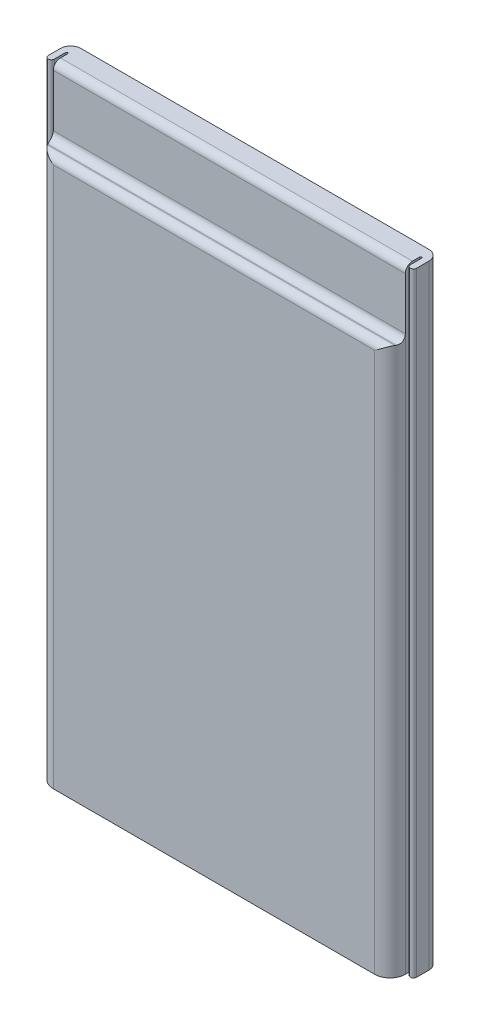
ISO-10303-21;
HEADER;
FILE_DESCRIPTION(('STEP AP214'),'2;1');
FILE_NAME('part.step','',(''),(''),'','','');
FILE_SCHEMA(('AUTOMOTIVE_DESIGN { 1 0 10303 214 1 1 1 1 }'));
ENDSEC;
DATA;
#1=APPLICATION_CONTEXT('core data for automotive mechanical design processes');
#2=APPLICATION_PROTOCOL_DEFINITION('international standard','automotive_design',2000,#1);
#3=PRODUCT_CONTEXT('',#1,'mechanical');
#4=PRODUCT('Part','Part','',(#3));
#5=PRODUCT_RELATED_PRODUCT_CATEGORY('part','',(#4));
#6=PRODUCT_DEFINITION_FORMATION('','',#4);
#7=PRODUCT_DEFINITION_CONTEXT('part definition',#1,'design');
#8=PRODUCT_DEFINITION('design','',#6,#7);
#9=PRODUCT_DEFINITION_SHAPE('','',#8);
#10=(LENGTH_UNIT() NAMED_UNIT(*) SI_UNIT(.MILLI.,.METRE.));
#11=(NAMED_UNIT(*) PLANE_ANGLE_UNIT() SI_UNIT($,.RADIAN.));
#12=(NAMED_UNIT(*) SI_UNIT($,.STERADIAN.) SOLID_ANGLE_UNIT());
#13=UNCERTAINTY_MEASURE_WITH_UNIT(LENGTH_MEASURE(1.E-05),#10,'distance_accuracy_value','');
#14=(GEOMETRIC_REPRESENTATION_CONTEXT(3) GLOBAL_UNCERTAINTY_ASSIGNED_CONTEXT((#13)) GLOBAL_UNIT_ASSIGNED_CONTEXT((#10,
#11,#12)) REPRESENTATION_CONTEXT('',''));
#15=CARTESIAN_POINT('',(0.,0.,0.));
#16=DIRECTION('',(0.,0.,1.));
#17=DIRECTION('',(1.,0.,0.));
#18=AXIS2_PLACEMENT_3D('',#15,#16,#17);
#19=CARTESIAN_POINT('',(-17.2,30.,2.5));
#20=DIRECTION('',(1.,0.,0.));
#21=DIRECTION('',(0.,0.,-1.));
#22=AXIS2_PLACEMENT_3D('',#19,#20,#21);
#23=PLANE('',#22);
#24=CARTESIAN_POINT('',(-17.2,29.3,1.8));
#25=DIRECTION('',(1.,0.,0.));
#26=DIRECTION('',(0.,0.,-1.));
#27=AXIS2_PLACEMENT_3D('',#24,#25,#26);
#28=CIRCLE('',#27,0.700000000000001);
#29=CARTESIAN_POINT('',(-17.2,30.,1.8));
#30=VERTEX_POINT('',#29);
#31=CARTESIAN_POINT('',(-17.2,29.3,2.5));
#32=VERTEX_POINT('',#31);
#33=EDGE_CURVE('E452',#30,#32,#28,.T.);
#34=ORIENTED_EDGE('',*,*,#33,.F.);
#35=DIRECTION('',(0.,0.,1.));
#36=VECTOR('',#35,1.);
#37=CARTESIAN_POINT('',(-17.2,30.,2.5));
#38=LINE('',#37,#36);
#39=CARTESIAN_POINT('',(-17.2,30.,1.1));
#40=VERTEX_POINT('',#39);
#41=EDGE_CURVE('E268',#40,#30,#38,.T.);
#42=ORIENTED_EDGE('',*,*,#41,.F.);
#43=DIRECTION('',(0.,-1.,0.));
#44=VECTOR('',#43,1.);
#45=CARTESIAN_POINT('',(-17.2,30.,1.1));
#46=LINE('',#45,#44);
#47=CARTESIAN_POINT('',(-17.2,-30.,1.1));
#48=VERTEX_POINT('',#47);
#49=EDGE_CURVE('E236',#40,#48,#46,.T.);
#50=ORIENTED_EDGE('',*,*,#49,.T.);
#51=DIRECTION('',(0.,0.,1.));
#52=VECTOR('',#51,1.);
#53=CARTESIAN_POINT('',(-17.2,-30.,2.5));
#54=LINE('',#53,#52);
#55=CARTESIAN_POINT('',(-17.2,-30.,2.5));
#56=VERTEX_POINT('',#55);
#57=EDGE_CURVE('E191',#48,#56,#54,.T.);
#58=ORIENTED_EDGE('',*,*,#57,.T.);
#59=DIRECTION('',(0.,-1.,0.));
#60=VECTOR('',#59,1.);
#61=CARTESIAN_POINT('',(-17.2,30.,2.5));
#62=LINE('',#61,#60);
#63=CARTESIAN_POINT('',(-17.2,24.2,2.5));
#64=VERTEX_POINT('',#63);
#65=EDGE_CURVE('E234',#64,#56,#62,.T.);
#66=ORIENTED_EDGE('',*,*,#65,.F.);
#67=DIRECTION('',(0.,-1.,0.));
#68=VECTOR('',#67,1.);
#69=CARTESIAN_POINT('',(-17.2,30.,2.5));
#70=LINE('',#69,#68);
#71=EDGE_CURVE('E435',#32,#64,#70,.T.);
#72=ORIENTED_EDGE('',*,*,#71,.F.);
#73=EDGE_LOOP('',(#34,#42,#50,#58,#66,#72));
#74=FACE_BOUND('',#73,.T.);
#75=ADVANCED_FACE('F35',(#74),#23,.F.);
#76=CARTESIAN_POINT('',(-15.7,30.,2.5));
#77=DIRECTION('',(0.,-1.,0.));
#78=DIRECTION('',(0.,0.,-1.));
#79=AXIS2_PLACEMENT_3D('',#76,#77,#78);
#80=CYLINDRICAL_SURFACE('',#79,1.5);
#81=CARTESIAN_POINT('',(-17.2,24.2,2.5));
#82=CARTESIAN_POINT('',(-17.1999561462918,24.1607046356708,2.49996665730778));
#83=CARTESIAN_POINT('',(-17.1999992482191,24.1214183542362,2.50330687650236));
#84=CARTESIAN_POINT('',(-17.1999354164387,24.043967429043,2.51649162392108));
#85=CARTESIAN_POINT('',(-17.1998285413028,24.0058023533524,2.52633361216168));
#86=CARTESIAN_POINT('',(-17.1991410740691,23.9316427129099,2.55228720768836));
#87=CARTESIAN_POINT('',(-17.198560198109,23.895649462663,2.56840256885166));
#88=CARTESIAN_POINT('',(-17.1963416248353,23.8268985139939,2.60642040046059));
#89=CARTESIAN_POINT('',(-17.1947040963163,23.7941402997553,2.62832194626366));
#90=CARTESIAN_POINT('',(-17.1897174760021,23.7331035334169,2.677010616108));
#91=CARTESIAN_POINT('',(-17.1863838519975,23.7047874718156,2.70375220489332));
#92=CARTESIAN_POINT('',(-17.1773485077593,23.6531440562724,2.76131822449821));
#93=CARTESIAN_POINT('',(-17.1716483772418,23.629813369279,2.79213990504022));
#94=CARTESIAN_POINT('',(-17.1576029305689,23.5895024190182,2.85553925871004));
#95=CARTESIAN_POINT('',(-17.1493602479741,23.5723237472487,2.88801374582642));
#96=CARTESIAN_POINT('',(-17.129901948259,23.5434557940061,2.95451175346917));
#97=CARTESIAN_POINT('',(-17.1186838942041,23.5317710340919,2.98853652472772));
#98=CARTESIAN_POINT('',(-17.0949002980657,23.5150221516101,3.05250454046783));
#99=CARTESIAN_POINT('',(-17.0826903337623,23.5093026309378,3.08241352289095));
#100=CARTESIAN_POINT('',(-17.0561914981021,23.5017861713414,3.14172953845446));
#101=CARTESIAN_POINT('',(-17.0419070504446,23.499981012626,3.17113749452255));
#102=CARTESIAN_POINT('',(-17.0266499161422,23.5,3.2));
#103=B_SPLINE_CURVE_WITH_KNOTS('',3,(#81,#82,#83,#84,#85,#86,#87,#88,#89,#90,#91,#92,#93,#94,
#95,#96,#97,#98,#99,#100,#101,#102),.UNSPECIFIED.,.F.,.F.,(4,2,2,2,2,2,2,2,2,2,4),(0.,
0.117731700981388,0.235417436029151,0.35317370069038,0.470911159062053,0.587593641092846,
0.704197867411868,0.816603597131317,0.929101676953001,1.0272186022184,1.12512929085055),.UNSPECIFIED.);
#104=CARTESIAN_POINT('',(-17.0266499161422,23.5,3.2));
#105=VERTEX_POINT('',#104);
#106=EDGE_CURVE('E432',#64,#105,#103,.T.);
#107=ORIENTED_EDGE('',*,*,#106,.F.);
#108=ORIENTED_EDGE('',*,*,#65,.T.);
#109=CARTESIAN_POINT('',(-15.7,-30.,2.5));
#110=DIRECTION('',(0.,1.,0.));
#111=DIRECTION('',(0.,0.,1.));
#112=AXIS2_PLACEMENT_3D('',#109,#110,#111);
#113=CIRCLE('',#112,1.5);
#114=CARTESIAN_POINT('',(-15.7,-30.,4.));
#115=VERTEX_POINT('',#114);
#116=EDGE_CURVE('E194',#56,#115,#113,.T.);
#117=ORIENTED_EDGE('',*,*,#116,.T.);
#118=DIRECTION('',(0.,-1.,0.));
#119=VECTOR('',#118,1.);
#120=CARTESIAN_POINT('',(-15.7,30.,4.));
#121=LINE('',#120,#119);
#122=CARTESIAN_POINT('',(-15.7,22.8,4.));
#123=VERTEX_POINT('',#122);
#124=EDGE_CURVE('E232',#123,#115,#121,.T.);
#125=ORIENTED_EDGE('',*,*,#124,.F.);
#126=CARTESIAN_POINT('',(-16.9688577540449,23.5,3.3));
#127=CARTESIAN_POINT('',(-16.9527784417981,23.4999982055545,3.32551396463836));
#128=CARTESIAN_POINT('',(-16.9359410582916,23.4986060689017,3.35050252186088));
#129=CARTESIAN_POINT('',(-16.9009676886166,23.4933665296013,3.39920481996247));
#130=CARTESIAN_POINT('',(-16.8828347064414,23.4895246527944,3.42292130005025));
#131=CARTESIAN_POINT('',(-16.8271702625634,23.474922406964,3.49142221954592));
#132=CARTESIAN_POINT('',(-16.7879636566091,23.4610687175682,3.53420132491162));
#133=CARTESIAN_POINT('',(-16.6958598687308,23.422878872689,3.62401554035444));
#134=CARTESIAN_POINT('',(-16.6420377008067,23.3967617112175,3.66930815190718));
#135=CARTESIAN_POINT('',(-16.5308303258263,23.337882443994,3.75080325405991));
#136=CARTESIAN_POINT('',(-16.4734254431628,23.3050808982158,3.78694879598608));
#137=CARTESIAN_POINT('',(-16.3325796058719,23.2208369597608,3.86331326015554));
#138=CARTESIAN_POINT('',(-16.2480697193284,23.1672485733349,3.89917970849285));
#139=CARTESIAN_POINT('',(-16.0770548572683,23.0556468566582,3.95461504825333));
#140=CARTESIAN_POINT('',(-15.9905529750847,22.9976401017942,3.97420766027137));
#141=CARTESIAN_POINT('',(-15.8380345556904,22.8942840524468,3.99509898601819));
#142=CARTESIAN_POINT('',(-15.7721970696737,22.8493196280466,3.99970591144029));
#143=CARTESIAN_POINT('',(-15.7042639764878,22.8029128504283,3.99999545061156));
#144=CARTESIAN_POINT('',(-15.7021319644632,22.8014564089068,3.99999999550149));
#145=CARTESIAN_POINT('',(-15.7,22.8,4.));
#146=B_SPLINE_CURVE_WITH_KNOTS('',3,(#126,#127,#128,#129,#130,#131,#132,#133,#134,#135,#136,
#137,#138,#139,#140,#141,#142,#143,#144,#145),.UNSPECIFIED.,.F.,.F.,(4,2,2,2,2,2,2,2,2,4),(0.,
0.0903647747938678,0.180526432789852,0.358599701535536,0.582545843187141,0.807853726825024,
1.12506490330325,1.44181290024312,1.68087549653736,1.688621475233),.UNSPECIFIED.);
#147=CARTESIAN_POINT('',(-16.9688577540449,23.5,3.3));
#148=VERTEX_POINT('',#147);
#149=EDGE_CURVE('E433',#148,#123,#146,.T.);
#150=ORIENTED_EDGE('',*,*,#149,.F.);
#151=CARTESIAN_POINT('',(-15.7,23.5,2.5));
#152=DIRECTION('',(0.,-1.,0.));
#153=DIRECTION('',(0.,0.,-1.));
#154=AXIS2_PLACEMENT_3D('',#151,#152,#153);
#155=CIRCLE('',#154,1.5);
#156=EDGE_CURVE('E426',#105,#148,#155,.F.);
#157=ORIENTED_EDGE('',*,*,#156,.F.);
#158=EDGE_LOOP('',(#107,#108,#117,#125,#150,#157));
#159=FACE_BOUND('',#158,.T.);
#160=ADVANCED_FACE('F360',(#159),#80,.T.);
#161=CARTESIAN_POINT('',(15.7,30.,2.5));
#162=DIRECTION('',(0.,-1.,0.));
#163=DIRECTION('',(0.,0.,-1.));
#164=AXIS2_PLACEMENT_3D('',#161,#162,#163);
#165=CYLINDRICAL_SURFACE('',#164,1.5);
#166=CARTESIAN_POINT('',(17.2,24.2,2.5));
#167=CARTESIAN_POINT('',(17.1999561462918,24.1607046356708,2.49996665730778));
#168=CARTESIAN_POINT('',(17.1999992482191,24.1214183542362,2.50330687650236));
#169=CARTESIAN_POINT('',(17.1999354164387,24.043967429043,2.51649162392108));
#170=CARTESIAN_POINT('',(17.1998285413028,24.0058023533524,2.52633361216168));
#171=CARTESIAN_POINT('',(17.1991410740691,23.9316427129099,2.55228720768836));
#172=CARTESIAN_POINT('',(17.198560198109,23.895649462663,2.56840256885166));
#173=CARTESIAN_POINT('',(17.1963416248353,23.8268985139939,2.60642040046059));
#174=CARTESIAN_POINT('',(17.1947040963163,23.7941402997553,2.62832194626366));
#175=CARTESIAN_POINT('',(17.1897174760021,23.7331035334169,2.677010616108));
#176=CARTESIAN_POINT('',(17.1863838519975,23.7047874718156,2.70375220489332));
#177=CARTESIAN_POINT('',(17.1773485077593,23.6531440562724,2.76131822449821));
#178=CARTESIAN_POINT('',(17.1716483772418,23.629813369279,2.79213990504022));
#179=CARTESIAN_POINT('',(17.1576029305689,23.5895024190182,2.85553925871004));
#180=CARTESIAN_POINT('',(17.1493602479741,23.5723237472487,2.88801374582642));
#181=CARTESIAN_POINT('',(17.1299019482591,23.5434557940061,2.95451175346917));
#182=CARTESIAN_POINT('',(17.1186838942042,23.5317710340919,2.98853652472772));
#183=CARTESIAN_POINT('',(17.0949002980657,23.5150221516101,3.05250454046783));
#184=CARTESIAN_POINT('',(17.0826903337623,23.5093026309378,3.08241352289095));
#185=CARTESIAN_POINT('',(17.0561914981021,23.5017861713414,3.14172953845446));
#186=CARTESIAN_POINT('',(17.0419070504446,23.499981012626,3.17113749452255));
#187=CARTESIAN_POINT('',(17.0266499161422,23.5,3.2));
#188=B_SPLINE_CURVE_WITH_KNOTS('',3,(#166,#167,#168,#169,#170,#171,#172,#173,#174,#175,#176,
#177,#178,#179,#180,#181,#182,#183,#184,#185,#186,#187),.UNSPECIFIED.,.F.,.F.,(4,2,2,2,2,2,2,2,
2,2,4),(0.,0.117731700981388,0.235417436029151,0.35317370069038,0.470911159062053,
0.587593641092846,0.704197867411868,0.816603597131316,0.929101676953001,1.0272186022184,
1.12512929085055),.UNSPECIFIED.);
#189=CARTESIAN_POINT('',(17.2,24.2,2.5));
#190=VERTEX_POINT('',#189);
#191=CARTESIAN_POINT('',(17.0266499161422,23.5,3.2));
#192=VERTEX_POINT('',#191);
#193=EDGE_CURVE('E339',#190,#192,#188,.T.);
#194=ORIENTED_EDGE('',*,*,#193,.T.);
#195=CARTESIAN_POINT('',(15.7,23.5,2.5));
#196=DIRECTION('',(0.,1.,0.));
#197=DIRECTION('',(0.,0.,1.));
#198=AXIS2_PLACEMENT_3D('',#195,#196,#197);
#199=CIRCLE('',#198,1.5);
#200=CARTESIAN_POINT('',(16.968857754045,23.5,3.3));
#201=VERTEX_POINT('',#200);
#202=EDGE_CURVE('E325',#192,#201,#199,.F.);
#203=ORIENTED_EDGE('',*,*,#202,.T.);
#204=CARTESIAN_POINT('',(16.968857754045,23.5,3.3));
#205=CARTESIAN_POINT('',(16.9527784417981,23.4999982055545,3.32551396463836));
#206=CARTESIAN_POINT('',(16.9359410582917,23.4986060689017,3.35050252186088));
#207=CARTESIAN_POINT('',(16.9009676886166,23.4933665296013,3.39920481996247));
#208=CARTESIAN_POINT('',(16.8828347064415,23.4895246527944,3.42292130005025));
#209=CARTESIAN_POINT('',(16.8271702625634,23.474922406964,3.49142221954592));
#210=CARTESIAN_POINT('',(16.7879636566091,23.4610687175682,3.53420132491162));
#211=CARTESIAN_POINT('',(16.6958598687309,23.422878872689,3.62401554035444));
#212=CARTESIAN_POINT('',(16.6420377008067,23.3967617112175,3.66930815190718));
#213=CARTESIAN_POINT('',(16.5308303258263,23.337882443994,3.75080325405991));
#214=CARTESIAN_POINT('',(16.4734254431628,23.3050808982158,3.78694879598608));
#215=CARTESIAN_POINT('',(16.3325796058719,23.2208369597608,3.86331326015554));
#216=CARTESIAN_POINT('',(16.2480697193285,23.1672485733349,3.89917970849285));
#217=CARTESIAN_POINT('',(16.0770548572683,23.0556468566582,3.95461504825333));
#218=CARTESIAN_POINT('',(15.9905529750847,22.9976401017942,3.97420766027137));
#219=CARTESIAN_POINT('',(15.8380345556904,22.8942840524468,3.99509898601819));
#220=CARTESIAN_POINT('',(15.7721970696737,22.8493196280466,3.99970591144029));
#221=CARTESIAN_POINT('',(15.7042639764878,22.8029128504283,3.99999545061156));
#222=CARTESIAN_POINT('',(15.7021319644632,22.8014564089068,3.99999999550149));
#223=CARTESIAN_POINT('',(15.7,22.8,4.));
#224=B_SPLINE_CURVE_WITH_KNOTS('',3,(#204,#205,#206,#207,#208,#209,#210,#211,#212,#213,#214,
#215,#216,#217,#218,#219,#220,#221,#222,#223),.UNSPECIFIED.,.F.,.F.,(4,2,2,2,2,2,2,2,2,4),(0.,
0.0903647747938678,0.180526432789852,0.358599701535536,0.582545843187141,0.807853726825024,
1.12506490330325,1.44181290024312,1.68087549653736,1.688621475233),.UNSPECIFIED.);
#225=CARTESIAN_POINT('',(15.7,22.8,4.));
#226=VERTEX_POINT('',#225);
#227=EDGE_CURVE('E316',#201,#226,#224,.T.);
#228=ORIENTED_EDGE('',*,*,#227,.T.);
#229=DIRECTION('',(0.,-1.,0.));
#230=VECTOR('',#229,1.);
#231=CARTESIAN_POINT('',(15.7,30.,4.));
#232=LINE('',#231,#230);
#233=CARTESIAN_POINT('',(15.7,-30.,4.));
#234=VERTEX_POINT('',#233);
#235=EDGE_CURVE('E230',#226,#234,#232,.T.);
#236=ORIENTED_EDGE('',*,*,#235,.T.);
#237=CARTESIAN_POINT('',(15.7,-30.,2.5));
#238=DIRECTION('',(0.,1.,0.));
#239=DIRECTION('',(0.,0.,-1.));
#240=AXIS2_PLACEMENT_3D('',#237,#238,#239);
#241=CIRCLE('',#240,1.5);
#242=CARTESIAN_POINT('',(17.2,-30.,2.5));
#243=VERTEX_POINT('',#242);
#244=EDGE_CURVE('E200',#234,#243,#241,.T.);
#245=ORIENTED_EDGE('',*,*,#244,.T.);
#246=DIRECTION('',(0.,-1.,0.));
#247=VECTOR('',#246,1.);
#248=CARTESIAN_POINT('',(17.2,30.,2.5));
#249=LINE('',#248,#247);
#250=EDGE_CURVE('E228',#190,#243,#249,.T.);
#251=ORIENTED_EDGE('',*,*,#250,.F.);
#252=EDGE_LOOP('',(#194,#203,#228,#236,#245,#251));
#253=FACE_BOUND('',#252,.T.);
#254=ADVANCED_FACE('F366',(#253),#165,.T.);
#255=CARTESIAN_POINT('',(17.2,30.,1.1));
#256=DIRECTION('',(-1.,0.,0.));
#257=DIRECTION('',(0.,0.,1.));
#258=AXIS2_PLACEMENT_3D('',#255,#256,#257);
#259=PLANE('',#258);
#260=CARTESIAN_POINT('',(17.2,29.3,1.8));
#261=DIRECTION('',(-1.,0.,0.));
#262=DIRECTION('',(0.,0.,1.));
#263=AXIS2_PLACEMENT_3D('',#260,#261,#262);
#264=CIRCLE('',#263,0.700000000000001);
#265=CARTESIAN_POINT('',(17.2,30.,1.8));
#266=VERTEX_POINT('',#265);
#267=CARTESIAN_POINT('',(17.2,29.3,2.5));
#268=VERTEX_POINT('',#267);
#269=EDGE_CURVE('E50',#266,#268,#264,.F.);
#270=ORIENTED_EDGE('',*,*,#269,.T.);
#271=DIRECTION('',(0.,-1.,0.));
#272=VECTOR('',#271,1.);
#273=CARTESIAN_POINT('',(17.2,29.3,2.5));
#274=LINE('',#273,#272);
#275=EDGE_CURVE('E183',#268,#190,#274,.T.);
#276=ORIENTED_EDGE('',*,*,#275,.T.);
#277=ORIENTED_EDGE('',*,*,#250,.T.);
#278=DIRECTION('',(0.,0.,-1.));
#279=VECTOR('',#278,1.);
#280=CARTESIAN_POINT('',(17.2,-30.,1.1));
#281=LINE('',#280,#279);
#282=CARTESIAN_POINT('',(17.2,-30.,1.1));
#283=VERTEX_POINT('',#282);
#284=EDGE_CURVE('E203',#243,#283,#281,.T.);
#285=ORIENTED_EDGE('',*,*,#284,.T.);
#286=DIRECTION('',(0.,-1.,0.));
#287=VECTOR('',#286,1.);
#288=CARTESIAN_POINT('',(17.2,30.,1.1));
#289=LINE('',#288,#287);
#290=CARTESIAN_POINT('',(17.2,30.,1.1));
#291=VERTEX_POINT('',#290);
#292=EDGE_CURVE('E225',#291,#283,#289,.T.);
#293=ORIENTED_EDGE('',*,*,#292,.F.);
#294=DIRECTION('',(0.,0.,-1.));
#295=VECTOR('',#294,1.);
#296=CARTESIAN_POINT('',(17.2,30.,1.1));
#297=LINE('',#296,#295);
#298=EDGE_CURVE('E271',#266,#291,#297,.T.);
#299=ORIENTED_EDGE('',*,*,#298,.F.);
#300=EDGE_LOOP('',(#270,#276,#277,#285,#293,#299));
#301=FACE_BOUND('',#300,.T.);
#302=ADVANCED_FACE('F383',(#301),#259,.F.);
#303=CARTESIAN_POINT('',(-17.,30.,1.));
#304=DIRECTION('',(0.,-1.,0.));
#305=DIRECTION('',(0.,0.,-1.));
#306=AXIS2_PLACEMENT_3D('',#303,#304,#305);
#307=CYLINDRICAL_SURFACE('',#306,0.999999999999999);
#308=CARTESIAN_POINT('',(-17.,-30.,1.));
#309=DIRECTION('',(0.,1.,0.));
#310=DIRECTION('',(0.,0.,1.));
#311=AXIS2_PLACEMENT_3D('',#308,#309,#310);
#312=CIRCLE('',#311,0.999999999999999);
#313=CARTESIAN_POINT('',(-17.,-30.,0.));
#314=VERTEX_POINT('',#313);
#315=CARTESIAN_POINT('',(-18.,-30.,1.));
#316=VERTEX_POINT('',#315);
#317=EDGE_CURVE('E179',#314,#316,#312,.T.);
#318=ORIENTED_EDGE('',*,*,#317,.T.);
#319=DIRECTION('',(0.,-1.,0.));
#320=VECTOR('',#319,1.);
#321=CARTESIAN_POINT('',(-18.,30.,1.));
#322=LINE('',#321,#320);
#323=CARTESIAN_POINT('',(-18.,30.,1.));
#324=VERTEX_POINT('',#323);
#325=EDGE_CURVE('E11',#324,#316,#322,.T.);
#326=ORIENTED_EDGE('',*,*,#325,.F.);
#327=CARTESIAN_POINT('',(-17.,30.,1.));
#328=DIRECTION('',(0.,1.,0.));
#329=DIRECTION('',(0.,0.,1.));
#330=AXIS2_PLACEMENT_3D('',#327,#328,#329);
#331=CIRCLE('',#330,0.999999999999999);
#332=CARTESIAN_POINT('',(-17.,30.,0.));
#333=VERTEX_POINT('',#332);
#334=EDGE_CURVE('E215',#333,#324,#331,.T.);
#335=ORIENTED_EDGE('',*,*,#334,.F.);
#336=DIRECTION('',(0.,-1.,0.));
#337=VECTOR('',#336,1.);
#338=CARTESIAN_POINT('',(-17.,30.,0.));
#339=LINE('',#338,#337);
#340=EDGE_CURVE('E175',#333,#314,#339,.T.);
#341=ORIENTED_EDGE('',*,*,#340,.T.);
#342=EDGE_LOOP('',(#318,#326,#335,#341));
#343=FACE_BOUND('',#342,.T.);
#344=ADVANCED_FACE('F37',(#343),#307,.T.);
#345=CARTESIAN_POINT('',(-18.,30.,1.));
#346=DIRECTION('',(1.,0.,0.));
#347=DIRECTION('',(0.,0.,-1.));
#348=AXIS2_PLACEMENT_3D('',#345,#346,#347);
#349=PLANE('',#348);
#350=DIRECTION('',(0.,0.,1.));
#351=VECTOR('',#350,1.);
#352=CARTESIAN_POINT('',(-18.,-30.,1.));
#353=LINE('',#352,#351);
#354=CARTESIAN_POINT('',(-18.,-30.,2.2));
#355=VERTEX_POINT('',#354);
#356=EDGE_CURVE('E182',#316,#355,#353,.T.);
#357=ORIENTED_EDGE('',*,*,#356,.T.);
#358=DIRECTION('',(0.,-1.,0.));
#359=VECTOR('',#358,1.);
#360=CARTESIAN_POINT('',(-18.,30.,2.2));
#361=LINE('',#360,#359);
#362=CARTESIAN_POINT('',(-18.,30.,2.2));
#363=VERTEX_POINT('',#362);
#364=EDGE_CURVE('E43',#363,#355,#361,.T.);
#365=ORIENTED_EDGE('',*,*,#364,.F.);
#366=DIRECTION('',(0.,0.,1.));
#367=VECTOR('',#366,1.);
#368=CARTESIAN_POINT('',(-18.,30.,1.));
#369=LINE('',#368,#367);
#370=EDGE_CURVE('E124',#324,#363,#369,.T.);
#371=ORIENTED_EDGE('',*,*,#370,.F.);
#372=ORIENTED_EDGE('',*,*,#325,.T.);
#373=EDGE_LOOP('',(#357,#365,#371,#372));
#374=FACE_BOUND('',#373,.T.);
#375=ADVANCED_FACE('F378',(#374),#349,.F.);
#376=CARTESIAN_POINT('',(-17.7,30.,2.2));
#377=DIRECTION('',(0.,-1.,0.));
#378=DIRECTION('',(0.,0.,-1.));
#379=AXIS2_PLACEMENT_3D('',#376,#377,#378);
#380=CYLINDRICAL_SURFACE('',#379,0.300000000000002);
#381=CARTESIAN_POINT('',(-17.7,-30.,2.2));
#382=DIRECTION('',(0.,1.,0.));
#383=DIRECTION('',(0.,0.,1.));
#384=AXIS2_PLACEMENT_3D('',#381,#382,#383);
#385=CIRCLE('',#384,0.300000000000002);
#386=CARTESIAN_POINT('',(-17.4,-30.,2.2));
#387=VERTEX_POINT('',#386);
#388=EDGE_CURVE('E185',#355,#387,#385,.T.);
#389=ORIENTED_EDGE('',*,*,#388,.T.);
#390=DIRECTION('',(0.,-1.,0.));
#391=VECTOR('',#390,1.);
#392=CARTESIAN_POINT('',(-17.4,30.,2.2));
#393=LINE('',#392,#391);
#394=CARTESIAN_POINT('',(-17.4,30.,2.2));
#395=VERTEX_POINT('',#394);
#396=EDGE_CURVE('E242',#395,#387,#393,.T.);
#397=ORIENTED_EDGE('',*,*,#396,.F.);
#398=CARTESIAN_POINT('',(-17.7,30.,2.2));
#399=DIRECTION('',(0.,1.,0.));
#400=DIRECTION('',(0.,0.,1.));
#401=AXIS2_PLACEMENT_3D('',#398,#399,#400);
#402=CIRCLE('',#401,0.300000000000002);
#403=EDGE_CURVE('E250',#363,#395,#402,.T.);
#404=ORIENTED_EDGE('',*,*,#403,.F.);
#405=ORIENTED_EDGE('',*,*,#364,.T.);
#406=EDGE_LOOP('',(#389,#397,#404,#405));
#407=FACE_BOUND('',#406,.T.);
#408=ADVANCED_FACE('F248',(#407),#380,.T.);
#409=CARTESIAN_POINT('',(-17.4,30.,2.2));
#410=DIRECTION('',(-1.,0.,0.));
#411=DIRECTION('',(0.,0.,1.));
#412=AXIS2_PLACEMENT_3D('',#409,#410,#411);
#413=PLANE('',#412);
#414=DIRECTION('',(0.,0.,-1.));
#415=VECTOR('',#414,1.);
#416=CARTESIAN_POINT('',(-17.4,-30.,2.2));
#417=LINE('',#416,#415);
#418=CARTESIAN_POINT('',(-17.4,-30.,1.1));
#419=VERTEX_POINT('',#418);
#420=EDGE_CURVE('E187',#387,#419,#417,.T.);
#421=ORIENTED_EDGE('',*,*,#420,.T.);
#422=DIRECTION('',(0.,-1.,0.));
#423=VECTOR('',#422,1.);
#424=CARTESIAN_POINT('',(-17.4,30.,1.1));
#425=LINE('',#424,#423);
#426=CARTESIAN_POINT('',(-17.4,30.,1.1));
#427=VERTEX_POINT('',#426);
#428=EDGE_CURVE('E239',#427,#419,#425,.T.);
#429=ORIENTED_EDGE('',*,*,#428,.F.);
#430=DIRECTION('',(0.,0.,-1.));
#431=VECTOR('',#430,1.);
#432=CARTESIAN_POINT('',(-17.4,30.,2.2));
#433=LINE('',#432,#431);
#434=EDGE_CURVE('E269',#395,#427,#433,.T.);
#435=ORIENTED_EDGE('',*,*,#434,.F.);
#436=ORIENTED_EDGE('',*,*,#396,.T.);
#437=EDGE_LOOP('',(#421,#429,#435,#436));
#438=FACE_BOUND('',#437,.T.);
#439=ADVANCED_FACE('F259',(#438),#413,.F.);
#440=CARTESIAN_POINT('',(-17.3,30.,1.1));
#441=DIRECTION('',(0.,-1.,0.));
#442=DIRECTION('',(0.,0.,-1.));
#443=AXIS2_PLACEMENT_3D('',#440,#441,#442);
#444=CYLINDRICAL_SURFACE('',#443,0.10000000000001);
#445=CARTESIAN_POINT('',(-17.3,-30.,1.1));
#446=DIRECTION('',(0.,-1.,0.));
#447=DIRECTION('',(0.,0.,1.));
#448=AXIS2_PLACEMENT_3D('',#445,#446,#447);
#449=CIRCLE('',#448,0.10000000000001);
#450=EDGE_CURVE('E189',#419,#48,#449,.T.);
#451=ORIENTED_EDGE('',*,*,#450,.T.);
#452=ORIENTED_EDGE('',*,*,#49,.F.);
#453=CARTESIAN_POINT('',(-17.3,30.,1.1));
#454=DIRECTION('',(0.,-1.,0.));
#455=DIRECTION('',(0.,0.,1.));
#456=AXIS2_PLACEMENT_3D('',#453,#454,#455);
#457=CIRCLE('',#456,0.10000000000001);
#458=EDGE_CURVE('E265',#427,#40,#457,.T.);
#459=ORIENTED_EDGE('',*,*,#458,.F.);
#460=ORIENTED_EDGE('',*,*,#428,.T.);
#461=EDGE_LOOP('',(#451,#452,#459,#460));
#462=FACE_BOUND('',#461,.T.);
#463=ADVANCED_FACE('F263',(#462),#444,.F.);
#464=CARTESIAN_POINT('',(-15.7,30.,4.));
#465=DIRECTION('',(0.,0.,-1.));
#466=DIRECTION('',(-1.,0.,0.));
#467=AXIS2_PLACEMENT_3D('',#464,#465,#466);
#468=PLANE('',#467);
#469=ORIENTED_EDGE('',*,*,#235,.F.);
#470=DIRECTION('',(-1.,0.,0.));
#471=VECTOR('',#470,1.);
#472=CARTESIAN_POINT('',(18.001,22.8,4.));
#473=LINE('',#472,#471);
#474=EDGE_CURVE('E301',#226,#123,#473,.T.);
#475=ORIENTED_EDGE('',*,*,#474,.T.);
#476=ORIENTED_EDGE('',*,*,#124,.T.);
#477=DIRECTION('',(1.,0.,0.));
#478=VECTOR('',#477,1.);
#479=CARTESIAN_POINT('',(-15.7,-30.,4.));
#480=LINE('',#479,#478);
#481=EDGE_CURVE('E197',#115,#234,#480,.T.);
#482=ORIENTED_EDGE('',*,*,#481,.T.);
#483=EDGE_LOOP('',(#469,#475,#476,#482));
#484=FACE_BOUND('',#483,.T.);
#485=ADVANCED_FACE('F374',(#484),#468,.F.);
#486=CARTESIAN_POINT('',(17.3,30.,1.1));
#487=DIRECTION('',(0.,-1.,0.));
#488=DIRECTION('',(0.,0.,-1.));
#489=AXIS2_PLACEMENT_3D('',#486,#487,#488);
#490=CYLINDRICAL_SURFACE('',#489,0.0999999999999994);
#491=CARTESIAN_POINT('',(17.3,-30.,1.1));
#492=DIRECTION('',(0.,-1.,0.));
#493=DIRECTION('',(0.,0.,-1.));
#494=AXIS2_PLACEMENT_3D('',#491,#492,#493);
#495=CIRCLE('',#494,0.0999999999999994);
#496=CARTESIAN_POINT('',(17.4,-30.,1.1));
#497=VERTEX_POINT('',#496);
#498=EDGE_CURVE('E205',#283,#497,#495,.T.);
#499=ORIENTED_EDGE('',*,*,#498,.T.);
#500=DIRECTION('',(0.,-1.,0.));
#501=VECTOR('',#500,1.);
#502=CARTESIAN_POINT('',(17.4,30.,1.1));
#503=LINE('',#502,#501);
#504=CARTESIAN_POINT('',(17.4,30.,1.1));
#505=VERTEX_POINT('',#504);
#506=EDGE_CURVE('E222',#505,#497,#503,.T.);
#507=ORIENTED_EDGE('',*,*,#506,.F.);
#508=CARTESIAN_POINT('',(17.3,30.,1.1));
#509=DIRECTION('',(0.,-1.,0.));
#510=DIRECTION('',(0.,0.,-1.));
#511=AXIS2_PLACEMENT_3D('',#508,#509,#510);
#512=CIRCLE('',#511,0.0999999999999994);
#513=EDGE_CURVE('E277',#291,#505,#512,.T.);
#514=ORIENTED_EDGE('',*,*,#513,.F.);
#515=ORIENTED_EDGE('',*,*,#292,.T.);
#516=EDGE_LOOP('',(#499,#507,#514,#515));
#517=FACE_BOUND('',#516,.T.);
#518=ADVANCED_FACE('F395',(#517),#490,.F.);
#519=CARTESIAN_POINT('',(17.4,30.,2.20000000000001));
#520=DIRECTION('',(1.,0.,0.));
#521=DIRECTION('',(0.,0.,-1.));
#522=AXIS2_PLACEMENT_3D('',#519,#520,#521);
#523=PLANE('',#522);
#524=DIRECTION('',(0.,0.,1.));
#525=VECTOR('',#524,1.);
#526=CARTESIAN_POINT('',(17.4,-30.,2.20000000000001));
#527=LINE('',#526,#525);
#528=CARTESIAN_POINT('',(17.4,-30.,2.20000000000001));
#529=VERTEX_POINT('',#528);
#530=EDGE_CURVE('E207',#497,#529,#527,.T.);
#531=ORIENTED_EDGE('',*,*,#530,.T.);
#532=DIRECTION('',(0.,-1.,0.));
#533=VECTOR('',#532,1.);
#534=CARTESIAN_POINT('',(17.4,30.,2.20000000000001));
#535=LINE('',#534,#533);
#536=CARTESIAN_POINT('',(17.4,30.,2.20000000000001));
#537=VERTEX_POINT('',#536);
#538=EDGE_CURVE('E219',#537,#529,#535,.T.);
#539=ORIENTED_EDGE('',*,*,#538,.F.);
#540=DIRECTION('',(0.,0.,1.));
#541=VECTOR('',#540,1.);
#542=CARTESIAN_POINT('',(17.4,30.,2.20000000000001));
#543=LINE('',#542,#541);
#544=EDGE_CURVE('E279',#505,#537,#543,.T.);
#545=ORIENTED_EDGE('',*,*,#544,.F.);
#546=ORIENTED_EDGE('',*,*,#506,.T.);
#547=EDGE_LOOP('',(#531,#539,#545,#546));
#548=FACE_BOUND('',#547,.T.);
#549=ADVANCED_FACE('F285',(#548),#523,.F.);
#550=CARTESIAN_POINT('',(17.7,30.,2.20000000000001));
#551=DIRECTION('',(0.,-1.,0.));
#552=DIRECTION('',(0.,0.,-1.));
#553=AXIS2_PLACEMENT_3D('',#550,#551,#552);
#554=CYLINDRICAL_SURFACE('',#553,0.300000000000002);
#555=CARTESIAN_POINT('',(17.7,-30.,2.20000000000001));
#556=DIRECTION('',(0.,1.,0.));
#557=DIRECTION('',(0.,0.,-1.));
#558=AXIS2_PLACEMENT_3D('',#555,#556,#557);
#559=CIRCLE('',#558,0.300000000000002);
#560=CARTESIAN_POINT('',(18.,-30.,2.20000000000001));
#561=VERTEX_POINT('',#560);
#562=EDGE_CURVE('E209',#529,#561,#559,.T.);
#563=ORIENTED_EDGE('',*,*,#562,.T.);
#564=DIRECTION('',(0.,-1.,0.));
#565=VECTOR('',#564,1.);
#566=CARTESIAN_POINT('',(18.,30.,2.20000000000001));
#567=LINE('',#566,#565);
#568=CARTESIAN_POINT('',(18.,30.,2.20000000000001));
#569=VERTEX_POINT('',#568);
#570=EDGE_CURVE('E170',#569,#561,#567,.T.);
#571=ORIENTED_EDGE('',*,*,#570,.F.);
#572=CARTESIAN_POINT('',(17.7,30.,2.20000000000001));
#573=DIRECTION('',(0.,1.,0.));
#574=DIRECTION('',(0.,0.,-1.));
#575=AXIS2_PLACEMENT_3D('',#572,#573,#574);
#576=CIRCLE('',#575,0.300000000000002);
#577=EDGE_CURVE('E158',#537,#569,#576,.T.);
#578=ORIENTED_EDGE('',*,*,#577,.F.);
#579=ORIENTED_EDGE('',*,*,#538,.T.);
#580=EDGE_LOOP('',(#563,#571,#578,#579));
#581=FACE_BOUND('',#580,.T.);
#582=ADVANCED_FACE('F289',(#581),#554,.T.);
#583=CARTESIAN_POINT('',(18.,30.,1.));
#584=DIRECTION('',(-1.,0.,0.));
#585=DIRECTION('',(0.,0.,1.));
#586=AXIS2_PLACEMENT_3D('',#583,#584,#585);
#587=PLANE('',#586);
#588=DIRECTION('',(0.,0.,-1.));
#589=VECTOR('',#588,1.);
#590=CARTESIAN_POINT('',(18.,-30.,1.));
#591=LINE('',#590,#589);
#592=CARTESIAN_POINT('',(18.,-30.,1.));
#593=VERTEX_POINT('',#592);
#594=EDGE_CURVE('E167',#561,#593,#591,.T.);
#595=ORIENTED_EDGE('',*,*,#594,.T.);
#596=DIRECTION('',(0.,-1.,0.));
#597=VECTOR('',#596,1.);
#598=CARTESIAN_POINT('',(18.,30.,1.));
#599=LINE('',#598,#597);
#600=CARTESIAN_POINT('',(18.,30.,1.));
#601=VERTEX_POINT('',#600);
#602=EDGE_CURVE('E164',#601,#593,#599,.T.);
#603=ORIENTED_EDGE('',*,*,#602,.F.);
#604=DIRECTION('',(0.,0.,-1.));
#605=VECTOR('',#604,1.);
#606=CARTESIAN_POINT('',(18.,30.,1.));
#607=LINE('',#606,#605);
#608=EDGE_CURVE('E151',#569,#601,#607,.T.);
#609=ORIENTED_EDGE('',*,*,#608,.F.);
#610=ORIENTED_EDGE('',*,*,#570,.T.);
#611=EDGE_LOOP('',(#595,#603,#609,#610));
#612=FACE_BOUND('',#611,.T.);
#613=ADVANCED_FACE('F165',(#612),#587,.F.);
#614=CARTESIAN_POINT('',(17.,30.,1.));
#615=DIRECTION('',(0.,-1.,0.));
#616=DIRECTION('',(0.,0.,-1.));
#617=AXIS2_PLACEMENT_3D('',#614,#615,#616);
#618=CYLINDRICAL_SURFACE('',#617,0.999999999999999);
#619=CARTESIAN_POINT('',(17.,-30.,1.));
#620=DIRECTION('',(0.,1.,0.));
#621=DIRECTION('',(0.,0.,-1.));
#622=AXIS2_PLACEMENT_3D('',#619,#620,#621);
#623=CIRCLE('',#622,0.999999999999999);
#624=CARTESIAN_POINT('',(17.,-30.,0.));
#625=VERTEX_POINT('',#624);
#626=EDGE_CURVE('E212',#593,#625,#623,.T.);
#627=ORIENTED_EDGE('',*,*,#626,.T.);
#628=DIRECTION('',(0.,-1.,0.));
#629=VECTOR('',#628,1.);
#630=CARTESIAN_POINT('',(17.,30.,0.));
#631=LINE('',#630,#629);
#632=CARTESIAN_POINT('',(17.,30.,0.));
#633=VERTEX_POINT('',#632);
#634=EDGE_CURVE('E171',#633,#625,#631,.T.);
#635=ORIENTED_EDGE('',*,*,#634,.F.);
#636=CARTESIAN_POINT('',(17.,30.,1.));
#637=DIRECTION('',(0.,1.,0.));
#638=DIRECTION('',(0.,0.,-1.));
#639=AXIS2_PLACEMENT_3D('',#636,#637,#638);
#640=CIRCLE('',#639,0.999999999999999);
#641=EDGE_CURVE('E155',#601,#633,#640,.T.);
#642=ORIENTED_EDGE('',*,*,#641,.F.);
#643=ORIENTED_EDGE('',*,*,#602,.T.);
#644=EDGE_LOOP('',(#627,#635,#642,#643));
#645=FACE_BOUND('',#644,.T.);
#646=ADVANCED_FACE('F173',(#645),#618,.T.);
#647=CARTESIAN_POINT('',(-17.,30.,0.));
#648=DIRECTION('',(0.,0.,1.));
#649=DIRECTION('',(1.,0.,0.));
#650=AXIS2_PLACEMENT_3D('',#647,#648,#649);
#651=PLANE('',#650);
#652=DIRECTION('',(-1.,0.,0.));
#653=VECTOR('',#652,1.);
#654=CARTESIAN_POINT('',(-17.,-30.,0.));
#655=LINE('',#654,#653);
#656=EDGE_CURVE('E116',#625,#314,#655,.T.);
#657=ORIENTED_EDGE('',*,*,#656,.T.);
#658=ORIENTED_EDGE('',*,*,#340,.F.);
#659=DIRECTION('',(-1.,0.,0.));
#660=VECTOR('',#659,1.);
#661=CARTESIAN_POINT('',(-17.,30.,0.));
#662=LINE('',#661,#660);
#663=EDGE_CURVE('E59',#633,#333,#662,.T.);
#664=ORIENTED_EDGE('',*,*,#663,.F.);
#665=ORIENTED_EDGE('',*,*,#634,.T.);
#666=EDGE_LOOP('',(#657,#658,#664,#665));
#667=FACE_BOUND('',#666,.T.);
#668=ADVANCED_FACE('F290',(#667),#651,.F.);
#669=CARTESIAN_POINT('',(-17.,30.,1.));
#670=DIRECTION('',(0.,1.,0.));
#671=DIRECTION('',(0.,0.,1.));
#672=AXIS2_PLACEMENT_3D('',#669,#670,#671);
#673=PLANE('',#672);
#674=DIRECTION('',(-1.,0.,0.));
#675=VECTOR('',#674,1.);
#676=CARTESIAN_POINT('',(18.001,30.,1.8));
#677=LINE('',#676,#675);
#678=EDGE_CURVE('E299',#266,#30,#677,.T.);
#679=ORIENTED_EDGE('',*,*,#678,.F.);
#680=ORIENTED_EDGE('',*,*,#298,.T.);
#681=ORIENTED_EDGE('',*,*,#513,.T.);
#682=ORIENTED_EDGE('',*,*,#544,.T.);
#683=ORIENTED_EDGE('',*,*,#577,.T.);
#684=ORIENTED_EDGE('',*,*,#608,.T.);
#685=ORIENTED_EDGE('',*,*,#641,.T.);
#686=ORIENTED_EDGE('',*,*,#663,.T.);
#687=ORIENTED_EDGE('',*,*,#334,.T.);
#688=ORIENTED_EDGE('',*,*,#370,.T.);
#689=ORIENTED_EDGE('',*,*,#403,.T.);
#690=ORIENTED_EDGE('',*,*,#434,.T.);
#691=ORIENTED_EDGE('',*,*,#458,.T.);
#692=ORIENTED_EDGE('',*,*,#41,.T.);
#693=EDGE_LOOP('',(#679,#680,#681,#682,#683,#684,#685,#686,#687,#688,#689,#690,#691,#692));
#694=FACE_BOUND('',#693,.T.);
#695=ADVANCED_FACE('F153',(#694),#673,.T.);
#696=CARTESIAN_POINT('',(-17.,-30.,1.));
#697=DIRECTION('',(0.,1.,0.));
#698=DIRECTION('',(0.,0.,1.));
#699=AXIS2_PLACEMENT_3D('',#696,#697,#698);
#700=PLANE('',#699);
#701=ORIENTED_EDGE('',*,*,#317,.F.);
#702=ORIENTED_EDGE('',*,*,#656,.F.);
#703=ORIENTED_EDGE('',*,*,#626,.F.);
#704=ORIENTED_EDGE('',*,*,#594,.F.);
#705=ORIENTED_EDGE('',*,*,#562,.F.);
#706=ORIENTED_EDGE('',*,*,#530,.F.);
#707=ORIENTED_EDGE('',*,*,#498,.F.);
#708=ORIENTED_EDGE('',*,*,#284,.F.);
#709=ORIENTED_EDGE('',*,*,#244,.F.);
#710=ORIENTED_EDGE('',*,*,#481,.F.);
#711=ORIENTED_EDGE('',*,*,#116,.F.);
#712=ORIENTED_EDGE('',*,*,#57,.F.);
#713=ORIENTED_EDGE('',*,*,#450,.F.);
#714=ORIENTED_EDGE('',*,*,#420,.F.);
#715=ORIENTED_EDGE('',*,*,#388,.F.);
#716=ORIENTED_EDGE('',*,*,#356,.F.);
#717=EDGE_LOOP('',(#701,#702,#703,#704,#705,#706,#707,#708,#709,#710,#711,#712,#713,#714,#715,#716));
#718=FACE_BOUND('',#717,.T.);
#719=ADVANCED_FACE('F254',(#718),#700,.F.);
#720=CARTESIAN_POINT('',(18.001,29.3,2.5));
#721=DIRECTION('',(0.,0.,1.));
#722=DIRECTION('',(1.,0.,0.));
#723=AXIS2_PLACEMENT_3D('',#720,#721,#722);
#724=PLANE('',#723);
#725=DIRECTION('',(-1.,0.,0.));
#726=VECTOR('',#725,1.);
#727=CARTESIAN_POINT('',(18.001,29.3,2.5));
#728=LINE('',#727,#726);
#729=EDGE_CURVE('E313',#268,#32,#728,.T.);
#730=ORIENTED_EDGE('',*,*,#729,.T.);
#731=ORIENTED_EDGE('',*,*,#71,.T.);
#732=DIRECTION('',(-1.,0.,0.));
#733=VECTOR('',#732,1.);
#734=CARTESIAN_POINT('',(18.001,24.2,2.5));
#735=LINE('',#734,#733);
#736=EDGE_CURVE('E310',#190,#64,#735,.T.);
#737=ORIENTED_EDGE('',*,*,#736,.F.);
#738=ORIENTED_EDGE('',*,*,#275,.F.);
#739=EDGE_LOOP('',(#730,#731,#737,#738));
#740=FACE_BOUND('',#739,.T.);
#741=ADVANCED_FACE('F336',(#740),#724,.T.);
#742=CARTESIAN_POINT('',(18.001,24.2,3.2));
#743=DIRECTION('',(-1.,0.,0.));
#744=DIRECTION('',(0.,0.,1.));
#745=AXIS2_PLACEMENT_3D('',#742,#743,#744);
#746=CYLINDRICAL_SURFACE('',#745,0.7);
#747=ORIENTED_EDGE('',*,*,#736,.T.);
#748=ORIENTED_EDGE('',*,*,#106,.T.);
#749=DIRECTION('',(-1.,0.,0.));
#750=VECTOR('',#749,1.);
#751=CARTESIAN_POINT('',(18.001,23.5,3.2));
#752=LINE('',#751,#750);
#753=EDGE_CURVE('E307',#192,#105,#752,.T.);
#754=ORIENTED_EDGE('',*,*,#753,.F.);
#755=ORIENTED_EDGE('',*,*,#193,.F.);
#756=EDGE_LOOP('',(#747,#748,#754,#755));
#757=FACE_BOUND('',#756,.T.);
#758=ADVANCED_FACE('F347',(#757),#746,.F.);
#759=CARTESIAN_POINT('',(18.001,23.5,3.2));
#760=DIRECTION('',(0.,1.,0.));
#761=DIRECTION('',(0.,0.,1.));
#762=AXIS2_PLACEMENT_3D('',#759,#760,#761);
#763=PLANE('',#762);
#764=ORIENTED_EDGE('',*,*,#753,.T.);
#765=ORIENTED_EDGE('',*,*,#156,.T.);
#766=DIRECTION('',(-1.,0.,0.));
#767=VECTOR('',#766,1.);
#768=CARTESIAN_POINT('',(18.001,23.5,3.3));
#769=LINE('',#768,#767);
#770=EDGE_CURVE('E304',#201,#148,#769,.T.);
#771=ORIENTED_EDGE('',*,*,#770,.F.);
#772=ORIENTED_EDGE('',*,*,#202,.F.);
#773=EDGE_LOOP('',(#764,#765,#771,#772));
#774=FACE_BOUND('',#773,.T.);
#775=ADVANCED_FACE('F350',(#774),#763,.T.);
#776=CARTESIAN_POINT('',(18.001,22.8,3.3));
#777=DIRECTION('',(-1.,0.,0.));
#778=DIRECTION('',(0.,0.,1.));
#779=AXIS2_PLACEMENT_3D('',#776,#777,#778);
#780=CYLINDRICAL_SURFACE('',#779,0.699999999999999);
#781=ORIENTED_EDGE('',*,*,#770,.T.);
#782=ORIENTED_EDGE('',*,*,#149,.T.);
#783=ORIENTED_EDGE('',*,*,#474,.F.);
#784=ORIENTED_EDGE('',*,*,#227,.F.);
#785=EDGE_LOOP('',(#781,#782,#783,#784));
#786=FACE_BOUND('',#785,.T.);
#787=ADVANCED_FACE('F327',(#786),#780,.T.);
#788=CARTESIAN_POINT('',(18.001,29.3,1.8));
#789=DIRECTION('',(-1.,0.,0.));
#790=DIRECTION('',(0.,0.,1.));
#791=AXIS2_PLACEMENT_3D('',#788,#789,#790);
#792=CYLINDRICAL_SURFACE('',#791,0.700000000000001);
#793=ORIENTED_EDGE('',*,*,#678,.T.);
#794=ORIENTED_EDGE('',*,*,#33,.T.);
#795=ORIENTED_EDGE('',*,*,#729,.F.);
#796=ORIENTED_EDGE('',*,*,#269,.F.);
#797=EDGE_LOOP('',(#793,#794,#795,#796));
#798=FACE_BOUND('',#797,.T.);
#799=ADVANCED_FACE('F357',(#798),#792,.T.);
#800=CLOSED_SHELL('',(#75,#160,#254,#302,#344,#375,#408,#439,#463,#485,#518,#549,#582,#613,#646,
#668,#695,#719,#741,#758,#775,#787,#799));
#801=MANIFOLD_SOLID_BREP('B2',#800);
#802=ADVANCED_BREP_SHAPE_REPRESENTATION('',(#18,#801),#14);
#803=SHAPE_DEFINITION_REPRESENTATION(#9,#802);
ENDSEC;
END-ISO-10303-21;
